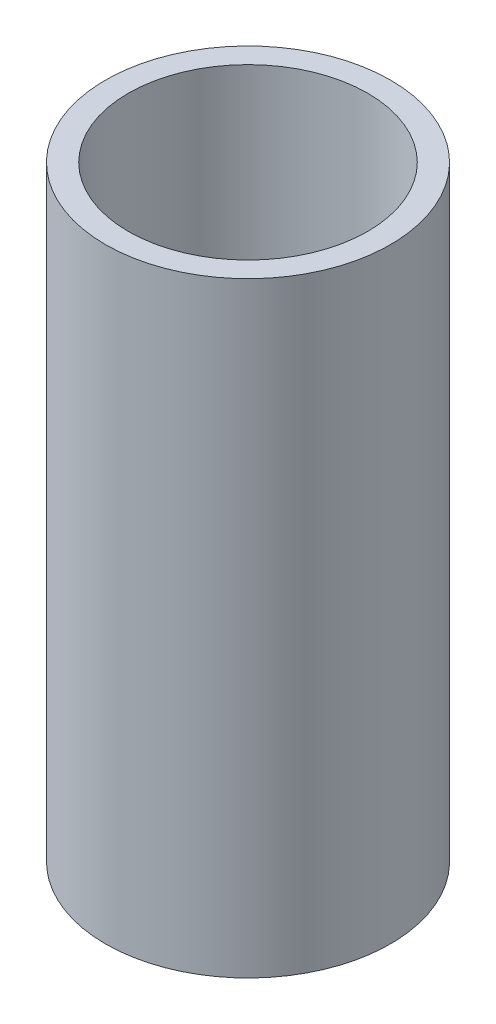
ISO-10303-21;
HEADER;
FILE_DESCRIPTION(('STEP AP214'),'2;1');
FILE_NAME('part.step','',(''),(''),'','','');
FILE_SCHEMA(('AUTOMOTIVE_DESIGN { 1 0 10303 214 1 1 1 1 }'));
ENDSEC;
DATA;
#1=APPLICATION_CONTEXT('core data for automotive mechanical design processes');
#2=APPLICATION_PROTOCOL_DEFINITION('international standard','automotive_design',2000,#1);
#3=PRODUCT_CONTEXT('',#1,'mechanical');
#4=PRODUCT('Part','Part','',(#3));
#5=PRODUCT_RELATED_PRODUCT_CATEGORY('part','',(#4));
#6=PRODUCT_DEFINITION_FORMATION('','',#4);
#7=PRODUCT_DEFINITION_CONTEXT('part definition',#1,'design');
#8=PRODUCT_DEFINITION('design','',#6,#7);
#9=PRODUCT_DEFINITION_SHAPE('','',#8);
#10=(LENGTH_UNIT() NAMED_UNIT(*) SI_UNIT(.MILLI.,.METRE.));
#11=(NAMED_UNIT(*) PLANE_ANGLE_UNIT() SI_UNIT($,.RADIAN.));
#12=(NAMED_UNIT(*) SI_UNIT($,.STERADIAN.) SOLID_ANGLE_UNIT());
#13=UNCERTAINTY_MEASURE_WITH_UNIT(LENGTH_MEASURE(1.E-05),#10,'distance_accuracy_value','');
#14=(GEOMETRIC_REPRESENTATION_CONTEXT(3) GLOBAL_UNCERTAINTY_ASSIGNED_CONTEXT((#13)) GLOBAL_UNIT_ASSIGNED_CONTEXT((#10,
#11,#12)) REPRESENTATION_CONTEXT('',''));
#15=CARTESIAN_POINT('',(0.,0.,0.));
#16=DIRECTION('',(0.,0.,1.));
#17=DIRECTION('',(1.,0.,0.));
#18=AXIS2_PLACEMENT_3D('',#15,#16,#17);
#19=CARTESIAN_POINT('',(12.5,53.12,0.));
#20=DIRECTION('',(0.,-1.,0.));
#21=DIRECTION('',(0.,0.,-1.));
#22=AXIS2_PLACEMENT_3D('',#19,#20,#21);
#23=PLANE('',#22);
#24=CARTESIAN_POINT('',(0.,53.12,0.));
#25=DIRECTION('',(0.,1.,0.));
#26=DIRECTION('',(0.,0.,1.));
#27=AXIS2_PLACEMENT_3D('',#24,#25,#26);
#28=CIRCLE('',#27,10.5);
#29=CARTESIAN_POINT('',(0.,53.12,10.5));
#30=VERTEX_POINT('',#29);
#31=EDGE_CURVE('E10',#30,#30,#28,.T.);
#32=ORIENTED_EDGE('',*,*,#31,.F.);
#33=EDGE_LOOP('',(#32));
#34=FACE_BOUND('',#33,.T.);
#35=CARTESIAN_POINT('',(0.,53.12,0.));
#36=DIRECTION('',(0.,1.,0.));
#37=DIRECTION('',(0.,0.,1.));
#38=AXIS2_PLACEMENT_3D('',#35,#36,#37);
#39=CIRCLE('',#38,12.5);
#40=CARTESIAN_POINT('',(0.,53.12,12.5));
#41=VERTEX_POINT('',#40);
#42=EDGE_CURVE('E47',#41,#41,#39,.T.);
#43=ORIENTED_EDGE('',*,*,#42,.T.);
#44=EDGE_LOOP('',(#43));
#45=FACE_BOUND('',#44,.T.);
#46=ADVANCED_FACE('F33',(#34,#45),#23,.F.);
#47=CARTESIAN_POINT('',(0.,55.1744599082592,0.));
#48=DIRECTION('',(0.,1.,0.));
#49=DIRECTION('',(0.,0.,1.));
#50=AXIS2_PLACEMENT_3D('',#47,#48,#49);
#51=CYLINDRICAL_SURFACE('',#50,10.5);
#52=CARTESIAN_POINT('',(0.,0.,0.));
#53=DIRECTION('',(0.,1.,0.));
#54=DIRECTION('',(0.,0.,1.));
#55=AXIS2_PLACEMENT_3D('',#52,#53,#54);
#56=CIRCLE('',#55,10.5);
#57=CARTESIAN_POINT('',(0.,0.,10.5));
#58=VERTEX_POINT('',#57);
#59=EDGE_CURVE('E39',#58,#58,#56,.T.);
#60=ORIENTED_EDGE('',*,*,#59,.F.);
#61=EDGE_LOOP('',(#60));
#62=FACE_BOUND('',#61,.T.);
#63=ORIENTED_EDGE('',*,*,#31,.T.);
#64=EDGE_LOOP('',(#63));
#65=FACE_BOUND('',#64,.T.);
#66=ADVANCED_FACE('F62',(#62,#65),#51,.F.);
#67=CARTESIAN_POINT('',(10.5,0.,0.));
#68=DIRECTION('',(0.,1.,0.));
#69=DIRECTION('',(0.,0.,1.));
#70=AXIS2_PLACEMENT_3D('',#67,#68,#69);
#71=PLANE('',#70);
#72=CARTESIAN_POINT('',(0.,0.,0.));
#73=DIRECTION('',(0.,1.,0.));
#74=DIRECTION('',(0.,0.,1.));
#75=AXIS2_PLACEMENT_3D('',#72,#73,#74);
#76=CIRCLE('',#75,12.5);
#77=CARTESIAN_POINT('',(0.,0.,12.5));
#78=VERTEX_POINT('',#77);
#79=EDGE_CURVE('E43',#78,#78,#76,.T.);
#80=ORIENTED_EDGE('',*,*,#79,.F.);
#81=EDGE_LOOP('',(#80));
#82=FACE_BOUND('',#81,.T.);
#83=ORIENTED_EDGE('',*,*,#59,.T.);
#84=EDGE_LOOP('',(#83));
#85=FACE_BOUND('',#84,.T.);
#86=ADVANCED_FACE('F57',(#82,#85),#71,.F.);
#87=CARTESIAN_POINT('',(0.,55.1744599082592,0.));
#88=DIRECTION('',(0.,1.,0.));
#89=DIRECTION('',(0.,0.,1.));
#90=AXIS2_PLACEMENT_3D('',#87,#88,#89);
#91=CYLINDRICAL_SURFACE('',#90,12.5);
#92=ORIENTED_EDGE('',*,*,#42,.F.);
#93=EDGE_LOOP('',(#92));
#94=FACE_BOUND('',#93,.T.);
#95=ORIENTED_EDGE('',*,*,#79,.T.);
#96=EDGE_LOOP('',(#95));
#97=FACE_BOUND('',#96,.T.);
#98=ADVANCED_FACE('F54',(#94,#97),#91,.T.);
#99=CLOSED_SHELL('',(#46,#66,#86,#98));
#100=MANIFOLD_SOLID_BREP('B2',#99);
#101=ADVANCED_BREP_SHAPE_REPRESENTATION('',(#18,#100),#14);
#102=SHAPE_DEFINITION_REPRESENTATION(#9,#101);
ENDSEC;
END-ISO-10303-21;
